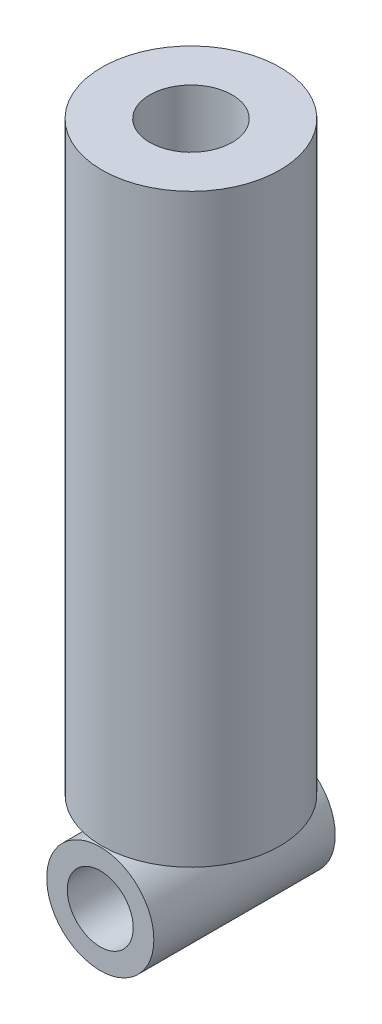
ISO-10303-21;
HEADER;
FILE_DESCRIPTION(('STEP AP214'),'2;1');
FILE_NAME('part.step','',(''),(''),'','','');
FILE_SCHEMA(('AUTOMOTIVE_DESIGN { 1 0 10303 214 1 1 1 1 }'));
ENDSEC;
DATA;
#1=APPLICATION_CONTEXT('core data for automotive mechanical design processes');
#2=APPLICATION_PROTOCOL_DEFINITION('international standard','automotive_design',2000,#1);
#3=PRODUCT_CONTEXT('',#1,'mechanical');
#4=PRODUCT('Part','Part','',(#3));
#5=PRODUCT_RELATED_PRODUCT_CATEGORY('part','',(#4));
#6=PRODUCT_DEFINITION_FORMATION('','',#4);
#7=PRODUCT_DEFINITION_CONTEXT('part definition',#1,'design');
#8=PRODUCT_DEFINITION('design','',#6,#7);
#9=PRODUCT_DEFINITION_SHAPE('','',#8);
#10=(LENGTH_UNIT() NAMED_UNIT(*) SI_UNIT(.MILLI.,.METRE.));
#11=(NAMED_UNIT(*) PLANE_ANGLE_UNIT() SI_UNIT($,.RADIAN.));
#12=(NAMED_UNIT(*) SI_UNIT($,.STERADIAN.) SOLID_ANGLE_UNIT());
#13=UNCERTAINTY_MEASURE_WITH_UNIT(LENGTH_MEASURE(1.E-05),#10,'distance_accuracy_value','');
#14=(GEOMETRIC_REPRESENTATION_CONTEXT(3) GLOBAL_UNCERTAINTY_ASSIGNED_CONTEXT((#13)) GLOBAL_UNIT_ASSIGNED_CONTEXT((#10,
#11,#12)) REPRESENTATION_CONTEXT('',''));
#15=CARTESIAN_POINT('',(0.,0.,0.));
#16=DIRECTION('',(0.,0.,1.));
#17=DIRECTION('',(1.,0.,0.));
#18=AXIS2_PLACEMENT_3D('',#15,#16,#17);
#19=CARTESIAN_POINT('',(0.,-32.5,55.));
#20=DIRECTION('',(0.,0.,1.));
#21=DIRECTION('',(1.,0.,0.));
#22=AXIS2_PLACEMENT_3D('',#19,#20,#21);
#23=PLANE('',#22);
#24=CARTESIAN_POINT('',(0.,-32.5,55.));
#25=DIRECTION('',(0.,0.,1.));
#26=DIRECTION('',(1.,0.,0.));
#27=AXIS2_PLACEMENT_3D('',#24,#25,#26);
#28=CIRCLE('',#27,32.5);
#29=CARTESIAN_POINT('',(32.5,-32.5,55.));
#30=VERTEX_POINT('',#29);
#31=EDGE_CURVE('E11',#30,#30,#28,.T.);
#32=ORIENTED_EDGE('',*,*,#31,.T.);
#33=EDGE_LOOP('',(#32));
#34=FACE_BOUND('',#33,.T.);
#35=CARTESIAN_POINT('',(0.,-32.5,55.));
#36=DIRECTION('',(0.,0.,1.));
#37=DIRECTION('',(1.,0.,0.));
#38=AXIS2_PLACEMENT_3D('',#35,#36,#37);
#39=CIRCLE('',#38,20.);
#40=CARTESIAN_POINT('',(20.,-32.5,55.));
#41=VERTEX_POINT('',#40);
#42=EDGE_CURVE('E51',#41,#41,#39,.T.);
#43=ORIENTED_EDGE('',*,*,#42,.F.);
#44=EDGE_LOOP('',(#43));
#45=FACE_BOUND('',#44,.T.);
#46=ADVANCED_FACE('F40',(#34,#45),#23,.T.);
#47=CARTESIAN_POINT('',(0.,-32.5,-55.));
#48=DIRECTION('',(0.,0.,1.));
#49=DIRECTION('',(1.,0.,0.));
#50=AXIS2_PLACEMENT_3D('',#47,#48,#49);
#51=PLANE('',#50);
#52=CARTESIAN_POINT('',(0.,-32.5,-55.));
#53=DIRECTION('',(0.,0.,1.));
#54=DIRECTION('',(1.,0.,0.));
#55=AXIS2_PLACEMENT_3D('',#52,#53,#54);
#56=CIRCLE('',#55,32.5);
#57=CARTESIAN_POINT('',(32.5,-32.5,-55.));
#58=VERTEX_POINT('',#57);
#59=EDGE_CURVE('E44',#58,#58,#56,.T.);
#60=ORIENTED_EDGE('',*,*,#59,.F.);
#61=EDGE_LOOP('',(#60));
#62=FACE_BOUND('',#61,.T.);
#63=CARTESIAN_POINT('',(0.,-32.5,-55.));
#64=DIRECTION('',(0.,0.,1.));
#65=DIRECTION('',(1.,0.,0.));
#66=AXIS2_PLACEMENT_3D('',#63,#64,#65);
#67=CIRCLE('',#66,20.);
#68=CARTESIAN_POINT('',(20.,-32.5,-55.));
#69=VERTEX_POINT('',#68);
#70=EDGE_CURVE('E53',#69,#69,#67,.T.);
#71=ORIENTED_EDGE('',*,*,#70,.T.);
#72=EDGE_LOOP('',(#71));
#73=FACE_BOUND('',#72,.T.);
#74=ADVANCED_FACE('F63',(#62,#73),#51,.F.);
#75=CARTESIAN_POINT('',(0.,-32.5,55.));
#76=DIRECTION('',(0.,0.,-1.));
#77=DIRECTION('',(-1.,0.,0.));
#78=AXIS2_PLACEMENT_3D('',#75,#76,#77);
#79=CYLINDRICAL_SURFACE('',#78,32.5);
#80=ORIENTED_EDGE('',*,*,#31,.F.);
#81=EDGE_LOOP('',(#80));
#82=FACE_BOUND('',#81,.T.);
#83=ORIENTED_EDGE('',*,*,#59,.T.);
#84=EDGE_LOOP('',(#83));
#85=FACE_BOUND('',#84,.T.);
#86=ADVANCED_FACE('F42',(#82,#85),#79,.T.);
#87=CARTESIAN_POINT('',(0.,-32.5,55.));
#88=DIRECTION('',(0.,0.,-1.));
#89=DIRECTION('',(-1.,0.,0.));
#90=AXIS2_PLACEMENT_3D('',#87,#88,#89);
#91=CYLINDRICAL_SURFACE('',#90,20.);
#92=ORIENTED_EDGE('',*,*,#42,.T.);
#93=EDGE_LOOP('',(#92));
#94=FACE_BOUND('',#93,.T.);
#95=ORIENTED_EDGE('',*,*,#70,.F.);
#96=EDGE_LOOP('',(#95));
#97=FACE_BOUND('',#96,.T.);
#98=ADVANCED_FACE('F59',(#94,#97),#91,.F.);
#99=CLOSED_SHELL('',(#46,#74,#86,#98));
#100=MANIFOLD_SOLID_BREP('B2',#99);
#101=CARTESIAN_POINT('',(0.,355.,0.));
#102=DIRECTION('',(0.,-1.,0.));
#103=DIRECTION('',(0.,0.,-1.));
#104=AXIS2_PLACEMENT_3D('',#101,#102,#103);
#105=CYLINDRICAL_SURFACE('',#104,54.);
#106=CARTESIAN_POINT('',(0.,355.,0.));
#107=DIRECTION('',(0.,1.,0.));
#108=DIRECTION('',(0.,0.,1.));
#109=AXIS2_PLACEMENT_3D('',#106,#107,#108);
#110=CIRCLE('',#109,54.);
#111=CARTESIAN_POINT('',(0.,355.,54.));
#112=VERTEX_POINT('',#111);
#113=EDGE_CURVE('E39',#112,#112,#110,.T.);
#114=ORIENTED_EDGE('',*,*,#113,.F.);
#115=EDGE_LOOP('',(#114));
#116=FACE_BOUND('',#115,.T.);
#117=CARTESIAN_POINT('',(0.,0.,0.));
#118=DIRECTION('',(0.,1.,0.));
#119=DIRECTION('',(0.,0.,1.));
#120=AXIS2_PLACEMENT_3D('',#117,#118,#119);
#121=CIRCLE('',#120,54.);
#122=CARTESIAN_POINT('',(0.,0.,54.));
#123=VERTEX_POINT('',#122);
#124=EDGE_CURVE('E104',#123,#123,#121,.T.);
#125=ORIENTED_EDGE('',*,*,#124,.T.);
#126=EDGE_LOOP('',(#125));
#127=FACE_BOUND('',#126,.T.);
#128=ADVANCED_FACE('F101',(#116,#127),#105,.T.);
#129=CARTESIAN_POINT('',(0.,355.,0.));
#130=DIRECTION('',(0.,1.,0.));
#131=DIRECTION('',(0.,0.,1.));
#132=AXIS2_PLACEMENT_3D('',#129,#130,#131);
#133=PLANE('',#132);
#134=CARTESIAN_POINT('',(0.,355.,0.));
#135=DIRECTION('',(0.,1.,0.));
#136=DIRECTION('',(0.,0.,1.));
#137=AXIS2_PLACEMENT_3D('',#134,#135,#136);
#138=CIRCLE('',#137,25.);
#139=CARTESIAN_POINT('',(0.,355.,25.));
#140=VERTEX_POINT('',#139);
#141=EDGE_CURVE('E113',#140,#140,#138,.T.);
#142=ORIENTED_EDGE('',*,*,#141,.F.);
#143=EDGE_LOOP('',(#142));
#144=FACE_BOUND('',#143,.T.);
#145=ORIENTED_EDGE('',*,*,#113,.T.);
#146=EDGE_LOOP('',(#145));
#147=FACE_BOUND('',#146,.T.);
#148=ADVANCED_FACE('F128',(#144,#147),#133,.T.);
#149=CARTESIAN_POINT('',(0.,0.,0.));
#150=DIRECTION('',(0.,1.,0.));
#151=DIRECTION('',(0.,0.,1.));
#152=AXIS2_PLACEMENT_3D('',#149,#150,#151);
#153=PLANE('',#152);
#154=ORIENTED_EDGE('',*,*,#124,.F.);
#155=EDGE_LOOP('',(#154));
#156=FACE_BOUND('',#155,.T.);
#157=ADVANCED_FACE('F124',(#156),#153,.F.);
#158=CARTESIAN_POINT('',(0.,15.,0.));
#159=DIRECTION('',(0.,1.,0.));
#160=DIRECTION('',(0.,0.,1.));
#161=AXIS2_PLACEMENT_3D('',#158,#159,#160);
#162=CYLINDRICAL_SURFACE('',#161,25.);
#163=CARTESIAN_POINT('',(0.,15.,0.));
#164=DIRECTION('',(0.,1.,0.));
#165=DIRECTION('',(0.,0.,1.));
#166=AXIS2_PLACEMENT_3D('',#163,#164,#165);
#167=CIRCLE('',#166,25.);
#168=CARTESIAN_POINT('',(0.,15.,25.));
#169=VERTEX_POINT('',#168);
#170=EDGE_CURVE('E111',#169,#169,#167,.T.);
#171=ORIENTED_EDGE('',*,*,#170,.F.);
#172=EDGE_LOOP('',(#171));
#173=FACE_BOUND('',#172,.T.);
#174=ORIENTED_EDGE('',*,*,#141,.T.);
#175=EDGE_LOOP('',(#174));
#176=FACE_BOUND('',#175,.T.);
#177=ADVANCED_FACE('F121',(#173,#176),#162,.F.);
#178=CARTESIAN_POINT('',(0.,15.,0.));
#179=DIRECTION('',(0.,1.,0.));
#180=DIRECTION('',(0.,0.,1.));
#181=AXIS2_PLACEMENT_3D('',#178,#179,#180);
#182=PLANE('',#181);
#183=ORIENTED_EDGE('',*,*,#170,.T.);
#184=EDGE_LOOP('',(#183));
#185=FACE_BOUND('',#184,.T.);
#186=ADVANCED_FACE('F119',(#185),#182,.T.);
#187=CLOSED_SHELL('',(#128,#148,#157,#177,#186));
#188=MANIFOLD_SOLID_BREP('B6',#187);
#189=ADVANCED_BREP_SHAPE_REPRESENTATION('',(#18,#100,#188),#14);
#190=SHAPE_DEFINITION_REPRESENTATION(#9,#189);
ENDSEC;
END-ISO-10303-21;
